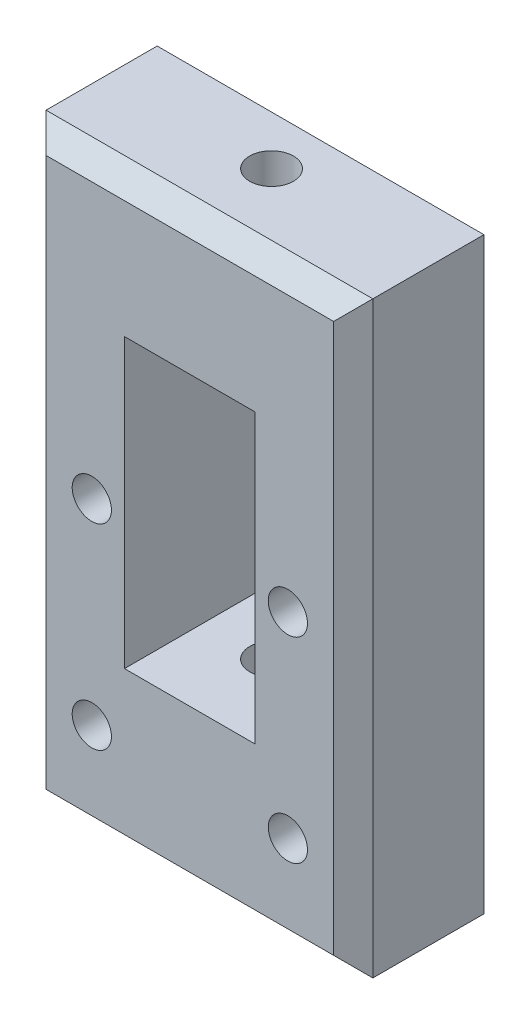
ISO-10303-21;
HEADER;
FILE_DESCRIPTION(('STEP AP214'),'2;1');
FILE_NAME('part.step','',(''),(''),'','','');
FILE_SCHEMA(('AUTOMOTIVE_DESIGN { 1 0 10303 214 1 1 1 1 }'));
ENDSEC;
DATA;
#1=APPLICATION_CONTEXT('core data for automotive mechanical design processes');
#2=APPLICATION_PROTOCOL_DEFINITION('international standard','automotive_design',2000,#1);
#3=PRODUCT_CONTEXT('',#1,'mechanical');
#4=PRODUCT('Part','Part','',(#3));
#5=PRODUCT_RELATED_PRODUCT_CATEGORY('part','',(#4));
#6=PRODUCT_DEFINITION_FORMATION('','',#4);
#7=PRODUCT_DEFINITION_CONTEXT('part definition',#1,'design');
#8=PRODUCT_DEFINITION('design','',#6,#7);
#9=PRODUCT_DEFINITION_SHAPE('','',#8);
#10=(LENGTH_UNIT() NAMED_UNIT(*) SI_UNIT(.MILLI.,.METRE.));
#11=(NAMED_UNIT(*) PLANE_ANGLE_UNIT() SI_UNIT($,.RADIAN.));
#12=(NAMED_UNIT(*) SI_UNIT($,.STERADIAN.) SOLID_ANGLE_UNIT());
#13=UNCERTAINTY_MEASURE_WITH_UNIT(LENGTH_MEASURE(1.E-05),#10,'distance_accuracy_value','');
#14=(GEOMETRIC_REPRESENTATION_CONTEXT(3) GLOBAL_UNCERTAINTY_ASSIGNED_CONTEXT((#13)) GLOBAL_UNIT_ASSIGNED_CONTEXT((#10,
#11,#12)) REPRESENTATION_CONTEXT('',''));
#15=CARTESIAN_POINT('',(0.,0.,0.));
#16=DIRECTION('',(0.,0.,1.));
#17=DIRECTION('',(1.,0.,0.));
#18=AXIS2_PLACEMENT_3D('',#15,#16,#17);
#19=CARTESIAN_POINT('',(100.,5.,7.5));
#20=DIRECTION('',(0.,1.,0.));
#21=DIRECTION('',(0.,0.,1.));
#22=AXIS2_PLACEMENT_3D('',#19,#20,#21);
#23=CYLINDRICAL_SURFACE('',#22,3.35);
#24=CARTESIAN_POINT('',(100.,74.,7.5));
#25=DIRECTION('',(0.,1.,0.));
#26=DIRECTION('',(0.,0.,1.));
#27=AXIS2_PLACEMENT_3D('',#24,#25,#26);
#28=CIRCLE('',#27,3.35);
#29=CARTESIAN_POINT('',(100.,74.,10.85));
#30=VERTEX_POINT('',#29);
#31=EDGE_CURVE('E165',#30,#30,#28,.F.);
#32=CARTESIAN_POINT('',(100.,95.,7.5));
#33=DIRECTION('',(0.,1.,0.));
#34=DIRECTION('',(0.,0.,1.));
#35=AXIS2_PLACEMENT_3D('',#32,#33,#34);
#36=CIRCLE('',#35,3.35);
#37=CARTESIAN_POINT('',(100.,95.,10.85));
#38=VERTEX_POINT('',#37);
#39=EDGE_CURVE('E162',#38,#38,#36,.T.);
#40=CARTESIAN_POINT('',(100.,74.,10.85));
#41=CARTESIAN_POINT('',(100.,74.21875,10.85));
#42=CARTESIAN_POINT('',(100.,74.4375,10.85));
#43=CARTESIAN_POINT('',(100.,74.875,10.85));
#44=CARTESIAN_POINT('',(100.,75.09375,10.85));
#45=CARTESIAN_POINT('',(100.,75.53125,10.85));
#46=CARTESIAN_POINT('',(100.,75.75,10.85));
#47=CARTESIAN_POINT('',(100.,76.1875,10.85));
#48=CARTESIAN_POINT('',(100.,76.40625,10.85));
#49=CARTESIAN_POINT('',(100.,76.84375,10.85));
#50=CARTESIAN_POINT('',(100.,77.0625,10.85));
#51=CARTESIAN_POINT('',(100.,77.5,10.85));
#52=CARTESIAN_POINT('',(100.,77.71875,10.85));
#53=CARTESIAN_POINT('',(100.,78.15625,10.85));
#54=CARTESIAN_POINT('',(100.,78.375,10.85));
#55=CARTESIAN_POINT('',(100.,78.8125,10.85));
#56=CARTESIAN_POINT('',(100.,79.03125,10.85));
#57=CARTESIAN_POINT('',(100.,79.46875,10.85));
#58=CARTESIAN_POINT('',(100.,79.6875,10.85));
#59=CARTESIAN_POINT('',(100.,80.125,10.85));
#60=CARTESIAN_POINT('',(100.,80.34375,10.85));
#61=CARTESIAN_POINT('',(100.,80.78125,10.85));
#62=CARTESIAN_POINT('',(100.,81.,10.85));
#63=CARTESIAN_POINT('',(100.,81.4375,10.85));
#64=CARTESIAN_POINT('',(100.,81.65625,10.85));
#65=CARTESIAN_POINT('',(100.,82.09375,10.85));
#66=CARTESIAN_POINT('',(100.,82.3125,10.85));
#67=CARTESIAN_POINT('',(100.,82.75,10.85));
#68=CARTESIAN_POINT('',(100.,82.96875,10.85));
#69=CARTESIAN_POINT('',(100.,83.40625,10.85));
#70=CARTESIAN_POINT('',(100.,83.625,10.85));
#71=CARTESIAN_POINT('',(100.,84.0625,10.85));
#72=CARTESIAN_POINT('',(100.,84.28125,10.85));
#73=CARTESIAN_POINT('',(100.,84.71875,10.85));
#74=CARTESIAN_POINT('',(100.,84.9375,10.85));
#75=CARTESIAN_POINT('',(100.,85.375,10.85));
#76=CARTESIAN_POINT('',(100.,85.59375,10.85));
#77=CARTESIAN_POINT('',(100.,86.03125,10.85));
#78=CARTESIAN_POINT('',(100.,86.25,10.85));
#79=CARTESIAN_POINT('',(100.,86.6875,10.85));
#80=CARTESIAN_POINT('',(100.,86.90625,10.85));
#81=CARTESIAN_POINT('',(100.,87.34375,10.85));
#82=CARTESIAN_POINT('',(100.,87.5625,10.85));
#83=CARTESIAN_POINT('',(100.,88.,10.85));
#84=CARTESIAN_POINT('',(100.,88.21875,10.85));
#85=CARTESIAN_POINT('',(100.,88.65625,10.85));
#86=CARTESIAN_POINT('',(100.,88.875,10.85));
#87=CARTESIAN_POINT('',(100.,89.3125,10.85));
#88=CARTESIAN_POINT('',(100.,89.53125,10.85));
#89=CARTESIAN_POINT('',(100.,89.96875,10.85));
#90=CARTESIAN_POINT('',(100.,90.1875,10.85));
#91=CARTESIAN_POINT('',(100.,90.625,10.85));
#92=CARTESIAN_POINT('',(100.,90.84375,10.85));
#93=CARTESIAN_POINT('',(100.,91.28125,10.85));
#94=CARTESIAN_POINT('',(100.,91.5,10.85));
#95=CARTESIAN_POINT('',(100.,91.9375,10.85));
#96=CARTESIAN_POINT('',(100.,92.15625,10.85));
#97=CARTESIAN_POINT('',(100.,92.59375,10.85));
#98=CARTESIAN_POINT('',(100.,92.8125,10.85));
#99=CARTESIAN_POINT('',(100.,93.25,10.85));
#100=CARTESIAN_POINT('',(100.,93.46875,10.85));
#101=CARTESIAN_POINT('',(100.,93.90625,10.85));
#102=CARTESIAN_POINT('',(100.,94.125,10.85));
#103=CARTESIAN_POINT('',(100.,94.5625,10.85));
#104=CARTESIAN_POINT('',(100.,94.78125,10.85));
#105=CARTESIAN_POINT('',(100.,95.,10.85));
#106=B_SPLINE_CURVE_WITH_KNOTS('',3,(#40,#41,#42,#43,#44,#45,#46,#47,#48,#49,#50,#51,#52,#53,
#54,#55,#56,#57,#58,#59,#60,#61,#62,#63,#64,#65,#66,#67,#68,#69,#70,#71,#72,#73,#74,#75,#76,#77,
#78,#79,#80,#81,#82,#83,#84,#85,#86,#87,#88,#89,#90,#91,#92,#93,#94,#95,#96,#97,#98,#99,#100,
#101,#102,#103,#104,#105),.UNSPECIFIED.,.F.,.F.,(4,2,2,2,2,2,2,2,2,2,2,2,2,2,2,2,2,2,2,2,2,2,2,
2,2,2,2,2,2,2,2,2,4),(0.,0.656249999999997,1.31249999999999,1.96875000000001,2.625,3.28125,
3.9375,4.59374999999999,5.25,5.90625,6.5625,7.21875,7.87499999999999,8.53124999999999,9.1875,
9.84375,10.5,11.15625,11.8125,12.46875,13.125,13.78125,14.4375,15.09375,15.75,16.40625,17.0625,
17.71875,18.375,19.03125,19.6875,20.34375,21.),.UNSPECIFIED.);
#107=EDGE_CURVE('BSEAM35',#30,#38,#106,.T.);
#108=ORIENTED_EDGE('',*,*,#31,.T.);
#109=ORIENTED_EDGE('',*,*,#39,.T.);
#110=ORIENTED_EDGE('',*,*,#107,.T.);
#111=ORIENTED_EDGE('',*,*,#107,.F.);
#112=EDGE_LOOP('',(#108,#110,#109,#111));
#113=FACE_BOUND('',#112,.T.);
#114=ADVANCED_FACE('F35',(#113),#23,.F.);
#115=CARTESIAN_POINT('',(0.,0.,20.));
#116=DIRECTION('',(0.,0.,1.));
#117=DIRECTION('',(1.,0.,0.));
#118=AXIS2_PLACEMENT_3D('',#115,#116,#117);
#119=PLANE('',#118);
#120=DIRECTION('',(0.,-1.,0.));
#121=VECTOR('',#120,1.);
#122=CARTESIAN_POINT('',(78.,5.,20.));
#123=LINE('',#122,#121);
#124=CARTESIAN_POINT('',(78.,92.,20.));
#125=VERTEX_POINT('',#124);
#126=CARTESIAN_POINT('',(78.,8.,20.));
#127=VERTEX_POINT('',#126);
#128=EDGE_CURVE('E209',#125,#127,#123,.T.);
#129=ORIENTED_EDGE('',*,*,#128,.T.);
#130=DIRECTION('',(1.,0.,0.));
#131=VECTOR('',#130,1.);
#132=CARTESIAN_POINT('',(125.,8.,20.));
#133=LINE('',#132,#131);
#134=CARTESIAN_POINT('',(122.,8.,20.));
#135=VERTEX_POINT('',#134);
#136=EDGE_CURVE('E219',#127,#135,#133,.T.);
#137=ORIENTED_EDGE('',*,*,#136,.T.);
#138=DIRECTION('',(0.,1.,0.));
#139=VECTOR('',#138,1.);
#140=CARTESIAN_POINT('',(122.,95.,20.));
#141=LINE('',#140,#139);
#142=CARTESIAN_POINT('',(122.,92.,20.));
#143=VERTEX_POINT('',#142);
#144=EDGE_CURVE('E217',#135,#143,#141,.T.);
#145=ORIENTED_EDGE('',*,*,#144,.T.);
#146=DIRECTION('',(-1.,0.,0.));
#147=VECTOR('',#146,1.);
#148=CARTESIAN_POINT('',(75.,92.,20.));
#149=LINE('',#148,#147);
#150=EDGE_CURVE('E215',#143,#125,#149,.T.);
#151=ORIENTED_EDGE('',*,*,#150,.T.);
#152=EDGE_LOOP('',(#129,#137,#145,#151));
#153=FACE_BOUND('',#152,.T.);
#154=DIRECTION('',(-1.,0.,0.));
#155=VECTOR('',#154,1.);
#156=CARTESIAN_POINT('',(90.,74.,20.));
#157=LINE('',#156,#155);
#158=CARTESIAN_POINT('',(110.,74.,20.));
#159=VERTEX_POINT('',#158);
#160=CARTESIAN_POINT('',(90.,74.,20.));
#161=VERTEX_POINT('',#160);
#162=EDGE_CURVE('E121',#159,#161,#157,.T.);
#163=ORIENTED_EDGE('',*,*,#162,.F.);
#164=DIRECTION('',(0.,1.,0.));
#165=VECTOR('',#164,1.);
#166=CARTESIAN_POINT('',(110.,74.,20.));
#167=LINE('',#166,#165);
#168=CARTESIAN_POINT('',(110.,30.,20.));
#169=VERTEX_POINT('',#168);
#170=EDGE_CURVE('E139',#169,#159,#167,.T.);
#171=ORIENTED_EDGE('',*,*,#170,.F.);
#172=DIRECTION('',(1.,0.,0.));
#173=VECTOR('',#172,1.);
#174=CARTESIAN_POINT('',(110.,30.,20.));
#175=LINE('',#174,#173);
#176=CARTESIAN_POINT('',(90.,30.,20.));
#177=VERTEX_POINT('',#176);
#178=EDGE_CURVE('E142',#177,#169,#175,.T.);
#179=ORIENTED_EDGE('',*,*,#178,.F.);
#180=DIRECTION('',(0.,-1.,0.));
#181=VECTOR('',#180,1.);
#182=CARTESIAN_POINT('',(90.,30.,20.));
#183=LINE('',#182,#181);
#184=EDGE_CURVE('E148',#161,#177,#183,.T.);
#185=ORIENTED_EDGE('',*,*,#184,.F.);
#186=EDGE_LOOP('',(#163,#171,#179,#185));
#187=FACE_BOUND('',#186,.T.);
#188=CARTESIAN_POINT('',(115.,50.,20.));
#189=DIRECTION('',(0.,0.,1.));
#190=DIRECTION('',(1.,0.,0.));
#191=AXIS2_PLACEMENT_3D('',#188,#189,#190);
#192=CIRCLE('',#191,3.00000000000001);
#193=CARTESIAN_POINT('',(118.,50.,20.));
#194=VERTEX_POINT('',#193);
#195=EDGE_CURVE('E172',#194,#194,#192,.T.);
#196=ORIENTED_EDGE('',*,*,#195,.F.);
#197=EDGE_LOOP('',(#196));
#198=FACE_BOUND('',#197,.T.);
#199=CARTESIAN_POINT('',(115.,20.,20.));
#200=DIRECTION('',(0.,0.,1.));
#201=DIRECTION('',(1.,0.,0.));
#202=AXIS2_PLACEMENT_3D('',#199,#200,#201);
#203=CIRCLE('',#202,3.00000000000001);
#204=CARTESIAN_POINT('',(118.,20.,20.));
#205=VERTEX_POINT('',#204);
#206=EDGE_CURVE('E184',#205,#205,#203,.T.);
#207=ORIENTED_EDGE('',*,*,#206,.F.);
#208=EDGE_LOOP('',(#207));
#209=FACE_BOUND('',#208,.T.);
#210=CARTESIAN_POINT('',(85.,20.,20.));
#211=DIRECTION('',(0.,0.,1.));
#212=DIRECTION('',(1.,0.,0.));
#213=AXIS2_PLACEMENT_3D('',#210,#211,#212);
#214=CIRCLE('',#213,3.00000000000001);
#215=CARTESIAN_POINT('',(88.,20.,20.));
#216=VERTEX_POINT('',#215);
#217=EDGE_CURVE('E178',#216,#216,#214,.T.);
#218=ORIENTED_EDGE('',*,*,#217,.F.);
#219=EDGE_LOOP('',(#218));
#220=FACE_BOUND('',#219,.T.);
#221=CARTESIAN_POINT('',(85.,50.,20.));
#222=DIRECTION('',(0.,0.,1.));
#223=DIRECTION('',(1.,0.,0.));
#224=AXIS2_PLACEMENT_3D('',#221,#222,#223);
#225=CIRCLE('',#224,3.00000000000001);
#226=CARTESIAN_POINT('',(88.,50.,20.));
#227=VERTEX_POINT('',#226);
#228=EDGE_CURVE('E166',#227,#227,#225,.T.);
#229=ORIENTED_EDGE('',*,*,#228,.F.);
#230=EDGE_LOOP('',(#229));
#231=FACE_BOUND('',#230,.T.);
#232=ADVANCED_FACE('F259',(#153,#187,#198,#209,#220,#231),#119,.T.);
#233=CARTESIAN_POINT('',(0.,0.,0.));
#234=DIRECTION('',(0.,0.,1.));
#235=DIRECTION('',(1.,0.,0.));
#236=AXIS2_PLACEMENT_3D('',#233,#234,#235);
#237=PLANE('',#236);
#238=DIRECTION('',(0.,1.,0.));
#239=VECTOR('',#238,1.);
#240=CARTESIAN_POINT('',(110.,70.,0.));
#241=LINE('',#240,#239);
#242=CARTESIAN_POINT('',(110.,30.,0.));
#243=VERTEX_POINT('',#242);
#244=CARTESIAN_POINT('',(110.,74.,0.));
#245=VERTEX_POINT('',#244);
#246=EDGE_CURVE('E126',#243,#245,#241,.T.);
#247=ORIENTED_EDGE('',*,*,#246,.T.);
#248=DIRECTION('',(-1.,0.,0.));
#249=VECTOR('',#248,1.);
#250=CARTESIAN_POINT('',(90.,74.,0.));
#251=LINE('',#250,#249);
#252=CARTESIAN_POINT('',(90.,74.,0.));
#253=VERTEX_POINT('',#252);
#254=EDGE_CURVE('E118',#245,#253,#251,.T.);
#255=ORIENTED_EDGE('',*,*,#254,.T.);
#256=DIRECTION('',(0.,-1.,0.));
#257=VECTOR('',#256,1.);
#258=CARTESIAN_POINT('',(90.,70.,0.));
#259=LINE('',#258,#257);
#260=CARTESIAN_POINT('',(90.,30.,0.));
#261=VERTEX_POINT('',#260);
#262=EDGE_CURVE('E130',#253,#261,#259,.T.);
#263=ORIENTED_EDGE('',*,*,#262,.T.);
#264=DIRECTION('',(1.,0.,0.));
#265=VECTOR('',#264,1.);
#266=CARTESIAN_POINT('',(110.,30.,0.));
#267=LINE('',#266,#265);
#268=EDGE_CURVE('E134',#261,#243,#267,.T.);
#269=ORIENTED_EDGE('',*,*,#268,.T.);
#270=EDGE_LOOP('',(#247,#255,#263,#269));
#271=FACE_BOUND('',#270,.T.);
#272=DIRECTION('',(0.,1.,0.));
#273=VECTOR('',#272,1.);
#274=CARTESIAN_POINT('',(125.,95.,0.));
#275=LINE('',#274,#273);
#276=CARTESIAN_POINT('',(125.,5.,0.));
#277=VERTEX_POINT('',#276);
#278=CARTESIAN_POINT('',(125.,95.,0.));
#279=VERTEX_POINT('',#278);
#280=EDGE_CURVE('E187',#277,#279,#275,.T.);
#281=ORIENTED_EDGE('',*,*,#280,.F.);
#282=DIRECTION('',(1.,0.,0.));
#283=VECTOR('',#282,1.);
#284=CARTESIAN_POINT('',(75.,5.,0.));
#285=LINE('',#284,#283);
#286=CARTESIAN_POINT('',(75.,5.,0.));
#287=VERTEX_POINT('',#286);
#288=EDGE_CURVE('E198',#287,#277,#285,.T.);
#289=ORIENTED_EDGE('',*,*,#288,.F.);
#290=DIRECTION('',(0.,-1.,0.));
#291=VECTOR('',#290,1.);
#292=CARTESIAN_POINT('',(75.,95.,0.));
#293=LINE('',#292,#291);
#294=CARTESIAN_POINT('',(75.,95.,0.));
#295=VERTEX_POINT('',#294);
#296=EDGE_CURVE('E195',#295,#287,#293,.T.);
#297=ORIENTED_EDGE('',*,*,#296,.F.);
#298=DIRECTION('',(-1.,0.,0.));
#299=VECTOR('',#298,1.);
#300=CARTESIAN_POINT('',(75.,95.,0.));
#301=LINE('',#300,#299);
#302=EDGE_CURVE('E192',#279,#295,#301,.T.);
#303=ORIENTED_EDGE('',*,*,#302,.F.);
#304=EDGE_LOOP('',(#281,#289,#297,#303));
#305=FACE_BOUND('',#304,.T.);
#306=CARTESIAN_POINT('',(115.,20.,0.));
#307=DIRECTION('',(0.,0.,1.));
#308=DIRECTION('',(1.,0.,0.));
#309=AXIS2_PLACEMENT_3D('',#306,#307,#308);
#310=CIRCLE('',#309,3.00000000000001);
#311=CARTESIAN_POINT('',(118.,20.,0.));
#312=VERTEX_POINT('',#311);
#313=EDGE_CURVE('E181',#312,#312,#310,.T.);
#314=ORIENTED_EDGE('',*,*,#313,.T.);
#315=EDGE_LOOP('',(#314));
#316=FACE_BOUND('',#315,.T.);
#317=CARTESIAN_POINT('',(85.,20.,0.));
#318=DIRECTION('',(0.,0.,1.));
#319=DIRECTION('',(1.,0.,0.));
#320=AXIS2_PLACEMENT_3D('',#317,#318,#319);
#321=CIRCLE('',#320,3.00000000000001);
#322=CARTESIAN_POINT('',(88.,20.,0.));
#323=VERTEX_POINT('',#322);
#324=EDGE_CURVE('E175',#323,#323,#321,.T.);
#325=ORIENTED_EDGE('',*,*,#324,.T.);
#326=EDGE_LOOP('',(#325));
#327=FACE_BOUND('',#326,.T.);
#328=CARTESIAN_POINT('',(115.,50.,0.));
#329=DIRECTION('',(0.,0.,1.));
#330=DIRECTION('',(1.,0.,0.));
#331=AXIS2_PLACEMENT_3D('',#328,#329,#330);
#332=CIRCLE('',#331,3.00000000000001);
#333=CARTESIAN_POINT('',(118.,50.,0.));
#334=VERTEX_POINT('',#333);
#335=EDGE_CURVE('E169',#334,#334,#332,.T.);
#336=ORIENTED_EDGE('',*,*,#335,.T.);
#337=EDGE_LOOP('',(#336));
#338=FACE_BOUND('',#337,.T.);
#339=CARTESIAN_POINT('',(85.,50.,0.));
#340=DIRECTION('',(0.,0.,1.));
#341=DIRECTION('',(1.,0.,0.));
#342=AXIS2_PLACEMENT_3D('',#339,#340,#341);
#343=CIRCLE('',#342,3.00000000000001);
#344=CARTESIAN_POINT('',(88.,50.,0.));
#345=VERTEX_POINT('',#344);
#346=EDGE_CURVE('E161',#345,#345,#343,.T.);
#347=ORIENTED_EDGE('',*,*,#346,.T.);
#348=EDGE_LOOP('',(#347));
#349=FACE_BOUND('',#348,.T.);
#350=ADVANCED_FACE('F136',(#271,#305,#316,#327,#338,#349),#237,.F.);
#351=CARTESIAN_POINT('',(125.,95.,20.));
#352=DIRECTION('',(-1.,0.,0.));
#353=DIRECTION('',(0.,0.,1.));
#354=AXIS2_PLACEMENT_3D('',#351,#352,#353);
#355=PLANE('',#354);
#356=DIRECTION('',(0.,0.,-1.));
#357=VECTOR('',#356,1.);
#358=CARTESIAN_POINT('',(125.,95.,20.));
#359=LINE('',#358,#357);
#360=CARTESIAN_POINT('',(125.,95.,17.));
#361=VERTEX_POINT('',#360);
#362=EDGE_CURVE('E207',#361,#279,#359,.T.);
#363=ORIENTED_EDGE('',*,*,#362,.F.);
#364=DIRECTION('',(0.,-1.,0.));
#365=VECTOR('',#364,1.);
#366=CARTESIAN_POINT('',(125.,5.,17.));
#367=LINE('',#366,#365);
#368=CARTESIAN_POINT('',(125.,5.,17.));
#369=VERTEX_POINT('',#368);
#370=EDGE_CURVE('E225',#361,#369,#367,.T.);
#371=ORIENTED_EDGE('',*,*,#370,.T.);
#372=DIRECTION('',(0.,0.,-1.));
#373=VECTOR('',#372,1.);
#374=CARTESIAN_POINT('',(125.,5.,20.));
#375=LINE('',#374,#373);
#376=EDGE_CURVE('E201',#369,#277,#375,.T.);
#377=ORIENTED_EDGE('',*,*,#376,.T.);
#378=ORIENTED_EDGE('',*,*,#280,.T.);
#379=EDGE_LOOP('',(#363,#371,#377,#378));
#380=FACE_BOUND('',#379,.T.);
#381=ADVANCED_FACE('F249',(#380),#355,.F.);
#382=CARTESIAN_POINT('',(75.,95.,20.));
#383=DIRECTION('',(0.,-1.,0.));
#384=DIRECTION('',(0.,0.,-1.));
#385=AXIS2_PLACEMENT_3D('',#382,#383,#384);
#386=PLANE('',#385);
#387=ORIENTED_EDGE('',*,*,#39,.F.);
#388=EDGE_LOOP('',(#387));
#389=FACE_BOUND('',#388,.T.);
#390=DIRECTION('',(0.,0.,-1.));
#391=VECTOR('',#390,1.);
#392=CARTESIAN_POINT('',(75.,95.,20.));
#393=LINE('',#392,#391);
#394=CARTESIAN_POINT('',(75.,95.,17.));
#395=VERTEX_POINT('',#394);
#396=EDGE_CURVE('E205',#395,#295,#393,.T.);
#397=ORIENTED_EDGE('',*,*,#396,.F.);
#398=DIRECTION('',(1.,0.,0.));
#399=VECTOR('',#398,1.);
#400=CARTESIAN_POINT('',(125.,95.,17.));
#401=LINE('',#400,#399);
#402=EDGE_CURVE('E45',#395,#361,#401,.T.);
#403=ORIENTED_EDGE('',*,*,#402,.T.);
#404=ORIENTED_EDGE('',*,*,#362,.T.);
#405=ORIENTED_EDGE('',*,*,#302,.T.);
#406=EDGE_LOOP('',(#397,#403,#404,#405));
#407=FACE_BOUND('',#406,.T.);
#408=ADVANCED_FACE('F286',(#389,#407),#386,.F.);
#409=CARTESIAN_POINT('',(75.,95.,20.));
#410=DIRECTION('',(1.,0.,0.));
#411=DIRECTION('',(0.,0.,-1.));
#412=AXIS2_PLACEMENT_3D('',#409,#410,#411);
#413=PLANE('',#412);
#414=DIRECTION('',(0.,0.,-1.));
#415=VECTOR('',#414,1.);
#416=CARTESIAN_POINT('',(75.,5.,20.));
#417=LINE('',#416,#415);
#418=CARTESIAN_POINT('',(75.,5.,17.));
#419=VERTEX_POINT('',#418);
#420=EDGE_CURVE('E203',#419,#287,#417,.T.);
#421=ORIENTED_EDGE('',*,*,#420,.F.);
#422=DIRECTION('',(0.,1.,0.));
#423=VECTOR('',#422,1.);
#424=CARTESIAN_POINT('',(75.,95.,17.));
#425=LINE('',#424,#423);
#426=EDGE_CURVE('E11',#419,#395,#425,.T.);
#427=ORIENTED_EDGE('',*,*,#426,.T.);
#428=ORIENTED_EDGE('',*,*,#396,.T.);
#429=ORIENTED_EDGE('',*,*,#296,.T.);
#430=EDGE_LOOP('',(#421,#427,#428,#429));
#431=FACE_BOUND('',#430,.T.);
#432=ADVANCED_FACE('F308',(#431),#413,.F.);
#433=CARTESIAN_POINT('',(75.,5.,20.));
#434=DIRECTION('',(0.,1.,0.));
#435=DIRECTION('',(0.,0.,1.));
#436=AXIS2_PLACEMENT_3D('',#433,#434,#435);
#437=PLANE('',#436);
#438=CARTESIAN_POINT('',(100.,5.,7.5));
#439=DIRECTION('',(0.,1.,0.));
#440=DIRECTION('',(0.,0.,1.));
#441=AXIS2_PLACEMENT_3D('',#438,#439,#440);
#442=CIRCLE('',#441,3.35);
#443=CARTESIAN_POINT('',(100.,5.,10.85));
#444=VERTEX_POINT('',#443);
#445=EDGE_CURVE('E158',#444,#444,#442,.T.);
#446=ORIENTED_EDGE('',*,*,#445,.T.);
#447=EDGE_LOOP('',(#446));
#448=FACE_BOUND('',#447,.T.);
#449=ORIENTED_EDGE('',*,*,#376,.F.);
#450=DIRECTION('',(-1.,0.,0.));
#451=VECTOR('',#450,1.);
#452=CARTESIAN_POINT('',(75.,5.,17.));
#453=LINE('',#452,#451);
#454=EDGE_CURVE('E222',#369,#419,#453,.T.);
#455=ORIENTED_EDGE('',*,*,#454,.T.);
#456=ORIENTED_EDGE('',*,*,#420,.T.);
#457=ORIENTED_EDGE('',*,*,#288,.T.);
#458=EDGE_LOOP('',(#449,#455,#456,#457));
#459=FACE_BOUND('',#458,.T.);
#460=ADVANCED_FACE('F252',(#448,#459),#437,.F.);
#461=CARTESIAN_POINT('',(115.,20.,20.));
#462=DIRECTION('',(0.,0.,-1.));
#463=DIRECTION('',(-1.,0.,0.));
#464=AXIS2_PLACEMENT_3D('',#461,#462,#463);
#465=CYLINDRICAL_SURFACE('',#464,3.00000000000001);
#466=ORIENTED_EDGE('',*,*,#206,.T.);
#467=EDGE_LOOP('',(#466));
#468=FACE_BOUND('',#467,.T.);
#469=ORIENTED_EDGE('',*,*,#313,.F.);
#470=EDGE_LOOP('',(#469));
#471=FACE_BOUND('',#470,.T.);
#472=ADVANCED_FACE('F307',(#468,#471),#465,.F.);
#473=CARTESIAN_POINT('',(85.,20.,20.));
#474=DIRECTION('',(0.,0.,-1.));
#475=DIRECTION('',(-1.,0.,0.));
#476=AXIS2_PLACEMENT_3D('',#473,#474,#475);
#477=CYLINDRICAL_SURFACE('',#476,3.00000000000001);
#478=ORIENTED_EDGE('',*,*,#217,.T.);
#479=EDGE_LOOP('',(#478));
#480=FACE_BOUND('',#479,.T.);
#481=ORIENTED_EDGE('',*,*,#324,.F.);
#482=EDGE_LOOP('',(#481));
#483=FACE_BOUND('',#482,.T.);
#484=ADVANCED_FACE('F313',(#480,#483),#477,.F.);
#485=CARTESIAN_POINT('',(115.,50.,20.));
#486=DIRECTION('',(0.,0.,-1.));
#487=DIRECTION('',(-1.,0.,0.));
#488=AXIS2_PLACEMENT_3D('',#485,#486,#487);
#489=CYLINDRICAL_SURFACE('',#488,3.00000000000001);
#490=ORIENTED_EDGE('',*,*,#195,.T.);
#491=EDGE_LOOP('',(#490));
#492=FACE_BOUND('',#491,.T.);
#493=ORIENTED_EDGE('',*,*,#335,.F.);
#494=EDGE_LOOP('',(#493));
#495=FACE_BOUND('',#494,.T.);
#496=ADVANCED_FACE('F277',(#492,#495),#489,.F.);
#497=CARTESIAN_POINT('',(85.,50.,20.));
#498=DIRECTION('',(0.,0.,-1.));
#499=DIRECTION('',(-1.,0.,0.));
#500=AXIS2_PLACEMENT_3D('',#497,#498,#499);
#501=CYLINDRICAL_SURFACE('',#500,3.00000000000001);
#502=ORIENTED_EDGE('',*,*,#228,.T.);
#503=EDGE_LOOP('',(#502));
#504=FACE_BOUND('',#503,.T.);
#505=ORIENTED_EDGE('',*,*,#346,.F.);
#506=EDGE_LOOP('',(#505));
#507=FACE_BOUND('',#506,.T.);
#508=ADVANCED_FACE('F273',(#504,#507),#501,.F.);
#509=CARTESIAN_POINT('',(100.,30.,7.5));
#510=DIRECTION('',(0.,-1.,0.));
#511=DIRECTION('',(0.,0.,-1.));
#512=AXIS2_PLACEMENT_3D('',#509,#510,#511);
#513=CIRCLE('',#512,3.35);
#514=CARTESIAN_POINT('',(100.,30.,10.85));
#515=VERTEX_POINT('',#514);
#516=EDGE_CURVE('E154',#515,#515,#513,.F.);
#517=CARTESIAN_POINT('',(100.,30.,10.85));
#518=CARTESIAN_POINT('',(100.,29.7395833333333,10.85));
#519=CARTESIAN_POINT('',(100.,29.4791666666667,10.85));
#520=CARTESIAN_POINT('',(100.,28.9583333333333,10.85));
#521=CARTESIAN_POINT('',(100.,28.6979166666667,10.85));
#522=CARTESIAN_POINT('',(100.,28.1770833333333,10.85));
#523=CARTESIAN_POINT('',(100.,27.9166666666667,10.85));
#524=CARTESIAN_POINT('',(100.,27.3958333333333,10.85));
#525=CARTESIAN_POINT('',(100.,27.1354166666667,10.85));
#526=CARTESIAN_POINT('',(100.,26.6145833333333,10.85));
#527=CARTESIAN_POINT('',(100.,26.3541666666667,10.85));
#528=CARTESIAN_POINT('',(100.,25.8333333333333,10.85));
#529=CARTESIAN_POINT('',(100.,25.5729166666667,10.85));
#530=CARTESIAN_POINT('',(100.,25.0520833333333,10.85));
#531=CARTESIAN_POINT('',(100.,24.7916666666667,10.85));
#532=CARTESIAN_POINT('',(100.,24.2708333333333,10.85));
#533=CARTESIAN_POINT('',(100.,24.0104166666667,10.85));
#534=CARTESIAN_POINT('',(100.,23.4895833333333,10.85));
#535=CARTESIAN_POINT('',(100.,23.2291666666667,10.85));
#536=CARTESIAN_POINT('',(100.,22.7083333333333,10.85));
#537=CARTESIAN_POINT('',(100.,22.4479166666667,10.85));
#538=CARTESIAN_POINT('',(100.,21.9270833333333,10.85));
#539=CARTESIAN_POINT('',(100.,21.6666666666667,10.85));
#540=CARTESIAN_POINT('',(100.,21.1458333333333,10.85));
#541=CARTESIAN_POINT('',(100.,20.8854166666667,10.85));
#542=CARTESIAN_POINT('',(100.,20.3645833333333,10.85));
#543=CARTESIAN_POINT('',(100.,20.1041666666667,10.85));
#544=CARTESIAN_POINT('',(100.,19.5833333333333,10.85));
#545=CARTESIAN_POINT('',(100.,19.3229166666667,10.85));
#546=CARTESIAN_POINT('',(100.,18.8020833333333,10.85));
#547=CARTESIAN_POINT('',(100.,18.5416666666667,10.85));
#548=CARTESIAN_POINT('',(100.,18.0208333333333,10.85));
#549=CARTESIAN_POINT('',(100.,17.7604166666667,10.85));
#550=CARTESIAN_POINT('',(100.,17.2395833333333,10.85));
#551=CARTESIAN_POINT('',(100.,16.9791666666667,10.85));
#552=CARTESIAN_POINT('',(100.,16.4583333333333,10.85));
#553=CARTESIAN_POINT('',(100.,16.1979166666667,10.85));
#554=CARTESIAN_POINT('',(100.,15.6770833333333,10.85));
#555=CARTESIAN_POINT('',(100.,15.4166666666667,10.85));
#556=CARTESIAN_POINT('',(100.,14.8958333333333,10.85));
#557=CARTESIAN_POINT('',(100.,14.6354166666667,10.85));
#558=CARTESIAN_POINT('',(100.,14.1145833333333,10.85));
#559=CARTESIAN_POINT('',(100.,13.8541666666667,10.85));
#560=CARTESIAN_POINT('',(100.,13.3333333333333,10.85));
#561=CARTESIAN_POINT('',(100.,13.0729166666667,10.85));
#562=CARTESIAN_POINT('',(100.,12.5520833333333,10.85));
#563=CARTESIAN_POINT('',(100.,12.2916666666667,10.85));
#564=CARTESIAN_POINT('',(100.,11.7708333333333,10.85));
#565=CARTESIAN_POINT('',(100.,11.5104166666667,10.85));
#566=CARTESIAN_POINT('',(100.,10.9895833333333,10.85));
#567=CARTESIAN_POINT('',(100.,10.7291666666667,10.85));
#568=CARTESIAN_POINT('',(100.,10.2083333333333,10.85));
#569=CARTESIAN_POINT('',(100.,9.94791666666667,10.85));
#570=CARTESIAN_POINT('',(100.,9.42708333333334,10.85));
#571=CARTESIAN_POINT('',(100.,9.16666666666667,10.85));
#572=CARTESIAN_POINT('',(100.,8.64583333333334,10.85));
#573=CARTESIAN_POINT('',(100.,8.38541666666667,10.85));
#574=CARTESIAN_POINT('',(100.,7.86458333333334,10.85));
#575=CARTESIAN_POINT('',(100.,7.60416666666667,10.85));
#576=CARTESIAN_POINT('',(100.,7.08333333333334,10.85));
#577=CARTESIAN_POINT('',(100.,6.82291666666667,10.85));
#578=CARTESIAN_POINT('',(100.,6.30208333333334,10.85));
#579=CARTESIAN_POINT('',(100.,6.04166666666667,10.85));
#580=CARTESIAN_POINT('',(100.,5.52083333333334,10.85));
#581=CARTESIAN_POINT('',(100.,5.26041666666667,10.85));
#582=CARTESIAN_POINT('',(100.,5.,10.85));
#583=B_SPLINE_CURVE_WITH_KNOTS('',3,(#517,#518,#519,#520,#521,#522,#523,#524,#525,#526,#527,
#528,#529,#530,#531,#532,#533,#534,#535,#536,#537,#538,#539,#540,#541,#542,#543,#544,#545,#546,
#547,#548,#549,#550,#551,#552,#553,#554,#555,#556,#557,#558,#559,#560,#561,#562,#563,#564,#565,
#566,#567,#568,#569,#570,#571,#572,#573,#574,#575,#576,#577,#578,#579,#580,#581,#582),
.UNSPECIFIED.,.F.,.F.,(4,2,2,2,2,2,2,2,2,2,2,2,2,2,2,2,2,2,2,2,2,2,2,2,2,2,2,2,2,2,2,2,4),(0.,
0.781250000000001,1.5625,2.34375,3.125,3.90625,4.6875,5.46875,6.25,7.03125,7.8125,8.59375,9.375,
10.15625,10.9375,11.71875,12.5,13.28125,14.0625,14.84375,15.625,16.40625,17.1875,17.96875,18.75,
19.53125,20.3125,21.09375,21.875,22.65625,23.4375,24.21875,25.),.UNSPECIFIED.);
#584=EDGE_CURVE('BSEAM276',#515,#444,#583,.T.);
#585=ORIENTED_EDGE('',*,*,#516,.T.);
#586=ORIENTED_EDGE('',*,*,#445,.F.);
#587=ORIENTED_EDGE('',*,*,#584,.T.);
#588=ORIENTED_EDGE('',*,*,#584,.F.);
#589=EDGE_LOOP('',(#585,#587,#586,#588));
#590=FACE_BOUND('',#589,.T.);
#591=ADVANCED_FACE('F276',(#590),#23,.F.);
#592=CARTESIAN_POINT('',(90.,74.,0.));
#593=DIRECTION('',(0.,1.,0.));
#594=DIRECTION('',(0.,0.,1.));
#595=AXIS2_PLACEMENT_3D('',#592,#593,#594);
#596=PLANE('',#595);
#597=ORIENTED_EDGE('',*,*,#162,.T.);
#598=DIRECTION('',(0.,0.,1.));
#599=VECTOR('',#598,1.);
#600=CARTESIAN_POINT('',(90.,74.,0.));
#601=LINE('',#600,#599);
#602=EDGE_CURVE('E113',#253,#161,#601,.T.);
#603=ORIENTED_EDGE('',*,*,#602,.F.);
#604=ORIENTED_EDGE('',*,*,#254,.F.);
#605=DIRECTION('',(0.,0.,1.));
#606=VECTOR('',#605,1.);
#607=CARTESIAN_POINT('',(110.,74.,0.));
#608=LINE('',#607,#606);
#609=EDGE_CURVE('E152',#245,#159,#608,.T.);
#610=ORIENTED_EDGE('',*,*,#609,.T.);
#611=EDGE_LOOP('',(#597,#603,#604,#610));
#612=FACE_BOUND('',#611,.T.);
#613=ORIENTED_EDGE('',*,*,#31,.F.);
#614=EDGE_LOOP('',(#613));
#615=FACE_BOUND('',#614,.T.);
#616=ADVANCED_FACE('F115',(#612,#615),#596,.F.);
#617=CARTESIAN_POINT('',(110.,30.,0.));
#618=DIRECTION('',(0.,-1.,0.));
#619=DIRECTION('',(0.,0.,-1.));
#620=AXIS2_PLACEMENT_3D('',#617,#618,#619);
#621=PLANE('',#620);
#622=ORIENTED_EDGE('',*,*,#178,.T.);
#623=DIRECTION('',(0.,0.,1.));
#624=VECTOR('',#623,1.);
#625=CARTESIAN_POINT('',(110.,30.,0.));
#626=LINE('',#625,#624);
#627=EDGE_CURVE('E155',#243,#169,#626,.T.);
#628=ORIENTED_EDGE('',*,*,#627,.F.);
#629=ORIENTED_EDGE('',*,*,#268,.F.);
#630=DIRECTION('',(0.,0.,1.));
#631=VECTOR('',#630,1.);
#632=CARTESIAN_POINT('',(90.,30.,0.));
#633=LINE('',#632,#631);
#634=EDGE_CURVE('E125',#261,#177,#633,.T.);
#635=ORIENTED_EDGE('',*,*,#634,.T.);
#636=EDGE_LOOP('',(#622,#628,#629,#635));
#637=FACE_BOUND('',#636,.T.);
#638=ORIENTED_EDGE('',*,*,#516,.F.);
#639=EDGE_LOOP('',(#638));
#640=FACE_BOUND('',#639,.T.);
#641=ADVANCED_FACE('F301',(#637,#640),#621,.F.);
#642=CARTESIAN_POINT('',(110.,74.,0.));
#643=DIRECTION('',(1.,0.,0.));
#644=DIRECTION('',(0.,0.,-1.));
#645=AXIS2_PLACEMENT_3D('',#642,#643,#644);
#646=PLANE('',#645);
#647=ORIENTED_EDGE('',*,*,#170,.T.);
#648=ORIENTED_EDGE('',*,*,#609,.F.);
#649=ORIENTED_EDGE('',*,*,#246,.F.);
#650=ORIENTED_EDGE('',*,*,#627,.T.);
#651=EDGE_LOOP('',(#647,#648,#649,#650));
#652=FACE_BOUND('',#651,.T.);
#653=ADVANCED_FACE('F340',(#652),#646,.F.);
#654=CARTESIAN_POINT('',(90.,30.,0.));
#655=DIRECTION('',(-1.,0.,0.));
#656=DIRECTION('',(0.,0.,1.));
#657=AXIS2_PLACEMENT_3D('',#654,#655,#656);
#658=PLANE('',#657);
#659=ORIENTED_EDGE('',*,*,#184,.T.);
#660=ORIENTED_EDGE('',*,*,#634,.F.);
#661=ORIENTED_EDGE('',*,*,#262,.F.);
#662=ORIENTED_EDGE('',*,*,#602,.T.);
#663=EDGE_LOOP('',(#659,#660,#661,#662));
#664=FACE_BOUND('',#663,.T.);
#665=ADVANCED_FACE('F131',(#664),#658,.F.);
#666=CARTESIAN_POINT('',(0.,92.,20.));
#667=DIRECTION('',(0.,0.707106781186549,0.707106781186546));
#668=DIRECTION('',(1.,0.,0.));
#669=AXIS2_PLACEMENT_3D('',#666,#667,#668);
#670=PLANE('',#669);
#671=DIRECTION('',(0.577350269189625,0.577350269189625,-0.577350269189628));
#672=VECTOR('',#671,1.);
#673=CARTESIAN_POINT('',(81.3333333333335,51.3333333333334,60.6666666666667));
#674=LINE('',#673,#672);
#675=EDGE_CURVE('E231',#361,#143,#674,.F.);
#676=ORIENTED_EDGE('',*,*,#675,.F.);
#677=ORIENTED_EDGE('',*,*,#402,.F.);
#678=DIRECTION('',(-0.577350269189625,0.577350269189625,-0.577350269189628));
#679=VECTOR('',#678,1.);
#680=CARTESIAN_POINT('',(108.666666666667,61.3333333333334,50.6666666666667));
#681=LINE('',#680,#679);
#682=EDGE_CURVE('E40',#125,#395,#681,.T.);
#683=ORIENTED_EDGE('',*,*,#682,.F.);
#684=ORIENTED_EDGE('',*,*,#150,.F.);
#685=EDGE_LOOP('',(#676,#677,#683,#684));
#686=FACE_BOUND('',#685,.T.);
#687=ADVANCED_FACE('F38',(#686),#670,.T.);
#688=CARTESIAN_POINT('',(78.,0.,20.));
#689=DIRECTION('',(-0.707106781186549,0.,0.707106781186546));
#690=DIRECTION('',(0.,1.,0.));
#691=AXIS2_PLACEMENT_3D('',#688,#689,#690);
#692=PLANE('',#691);
#693=ORIENTED_EDGE('',*,*,#682,.T.);
#694=ORIENTED_EDGE('',*,*,#426,.F.);
#695=DIRECTION('',(0.577350269189625,0.577350269189625,0.577350269189628));
#696=VECTOR('',#695,1.);
#697=CARTESIAN_POINT('',(75.3333333333334,5.33333333333334,17.3333333333333));
#698=LINE('',#697,#696);
#699=EDGE_CURVE('E230',#127,#419,#698,.F.);
#700=ORIENTED_EDGE('',*,*,#699,.F.);
#701=ORIENTED_EDGE('',*,*,#128,.F.);
#702=EDGE_LOOP('',(#693,#694,#700,#701));
#703=FACE_BOUND('',#702,.T.);
#704=ADVANCED_FACE('F241',(#703),#692,.T.);
#705=CARTESIAN_POINT('',(122.,0.,20.));
#706=DIRECTION('',(0.707106781186549,0.,0.707106781186546));
#707=DIRECTION('',(0.,-1.,0.));
#708=AXIS2_PLACEMENT_3D('',#705,#706,#707);
#709=PLANE('',#708);
#710=ORIENTED_EDGE('',*,*,#675,.T.);
#711=ORIENTED_EDGE('',*,*,#144,.F.);
#712=DIRECTION('',(0.577350269189625,-0.577350269189625,-0.577350269189628));
#713=VECTOR('',#712,1.);
#714=CARTESIAN_POINT('',(124.666666666667,5.33333333333334,17.3333333333333));
#715=LINE('',#714,#713);
#716=EDGE_CURVE('E228',#369,#135,#715,.F.);
#717=ORIENTED_EDGE('',*,*,#716,.F.);
#718=ORIENTED_EDGE('',*,*,#370,.F.);
#719=EDGE_LOOP('',(#710,#711,#717,#718));
#720=FACE_BOUND('',#719,.T.);
#721=ADVANCED_FACE('F246',(#720),#709,.T.);
#722=CARTESIAN_POINT('',(0.,8.,20.));
#723=DIRECTION('',(0.,-0.707106781186549,0.707106781186546));
#724=DIRECTION('',(-1.,0.,0.));
#725=AXIS2_PLACEMENT_3D('',#722,#723,#724);
#726=PLANE('',#725);
#727=ORIENTED_EDGE('',*,*,#699,.T.);
#728=ORIENTED_EDGE('',*,*,#454,.F.);
#729=ORIENTED_EDGE('',*,*,#716,.T.);
#730=ORIENTED_EDGE('',*,*,#136,.F.);
#731=EDGE_LOOP('',(#727,#728,#729,#730));
#732=FACE_BOUND('',#731,.T.);
#733=ADVANCED_FACE('F256',(#732),#726,.T.);
#734=CLOSED_SHELL('',(#114,#232,#350,#381,#408,#432,#460,#472,#484,#496,#508,#591,#616,#641,
#653,#665,#687,#704,#721,#733));
#735=MANIFOLD_SOLID_BREP('B2',#734);
#736=ADVANCED_BREP_SHAPE_REPRESENTATION('',(#18,#735),#14);
#737=SHAPE_DEFINITION_REPRESENTATION(#9,#736);
ENDSEC;
END-ISO-10303-21;
